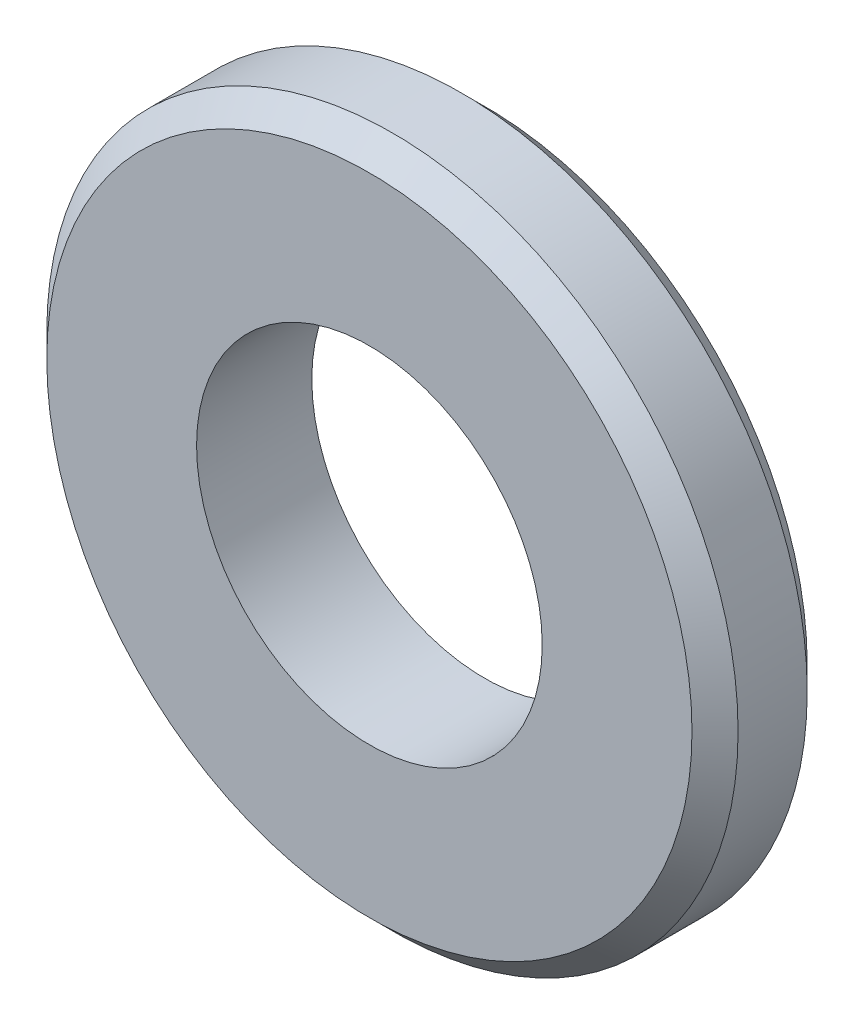
ISO-10303-21;
HEADER;
FILE_DESCRIPTION(('STEP AP214'),'2;1');
FILE_NAME('part.step','',(''),(''),'','','');
FILE_SCHEMA(('AUTOMOTIVE_DESIGN { 1 0 10303 214 1 1 1 1 }'));
ENDSEC;
DATA;
#1=APPLICATION_CONTEXT('core data for automotive mechanical design processes');
#2=APPLICATION_PROTOCOL_DEFINITION('international standard','automotive_design',2000,#1);
#3=PRODUCT_CONTEXT('',#1,'mechanical');
#4=PRODUCT('Part','Part','',(#3));
#5=PRODUCT_RELATED_PRODUCT_CATEGORY('part','',(#4));
#6=PRODUCT_DEFINITION_FORMATION('','',#4);
#7=PRODUCT_DEFINITION_CONTEXT('part definition',#1,'design');
#8=PRODUCT_DEFINITION('design','',#6,#7);
#9=PRODUCT_DEFINITION_SHAPE('','',#8);
#10=(LENGTH_UNIT() NAMED_UNIT(*) SI_UNIT(.MILLI.,.METRE.));
#11=(NAMED_UNIT(*) PLANE_ANGLE_UNIT() SI_UNIT($,.RADIAN.));
#12=(NAMED_UNIT(*) SI_UNIT($,.STERADIAN.) SOLID_ANGLE_UNIT());
#13=UNCERTAINTY_MEASURE_WITH_UNIT(LENGTH_MEASURE(1.E-05),#10,'distance_accuracy_value','');
#14=(GEOMETRIC_REPRESENTATION_CONTEXT(3) GLOBAL_UNCERTAINTY_ASSIGNED_CONTEXT((#13)) GLOBAL_UNIT_ASSIGNED_CONTEXT((#10,
#11,#12)) REPRESENTATION_CONTEXT('',''));
#15=CARTESIAN_POINT('',(0.,0.,0.));
#16=DIRECTION('',(0.,0.,1.));
#17=DIRECTION('',(1.,0.,0.));
#18=AXIS2_PLACEMENT_3D('',#15,#16,#17);
#19=CARTESIAN_POINT('',(0.,0.,0.5));
#20=DIRECTION('',(0.,0.,1.));
#21=DIRECTION('',(1.,0.,0.));
#22=AXIS2_PLACEMENT_3D('',#19,#20,#21);
#23=PLANE('',#22);
#24=CARTESIAN_POINT('',(0.,0.,0.5));
#25=DIRECTION('',(0.,0.,1.));
#26=DIRECTION('',(1.,0.,0.));
#27=AXIS2_PLACEMENT_3D('',#24,#25,#26);
#28=CIRCLE('',#27,2.8);
#29=CARTESIAN_POINT('',(2.8,0.,0.5));
#30=VERTEX_POINT('',#29);
#31=EDGE_CURVE('E51',#30,#30,#28,.T.);
#32=ORIENTED_EDGE('',*,*,#31,.T.);
#33=EDGE_LOOP('',(#32));
#34=FACE_BOUND('',#33,.T.);
#35=CARTESIAN_POINT('',(0.,0.,0.5));
#36=DIRECTION('',(0.,0.,1.));
#37=DIRECTION('',(1.,0.,0.));
#38=AXIS2_PLACEMENT_3D('',#35,#36,#37);
#39=CIRCLE('',#38,1.5);
#40=CARTESIAN_POINT('',(1.5,0.,0.5));
#41=VERTEX_POINT('',#40);
#42=EDGE_CURVE('E56',#41,#41,#39,.T.);
#43=ORIENTED_EDGE('',*,*,#42,.F.);
#44=EDGE_LOOP('',(#43));
#45=FACE_BOUND('',#44,.T.);
#46=ADVANCED_FACE('F35',(#34,#45),#23,.T.);
#47=CARTESIAN_POINT('',(0.,0.,-0.5));
#48=DIRECTION('',(0.,0.,1.));
#49=DIRECTION('',(1.,0.,0.));
#50=AXIS2_PLACEMENT_3D('',#47,#48,#49);
#51=PLANE('',#50);
#52=CARTESIAN_POINT('',(0.,0.,-0.5));
#53=DIRECTION('',(0.,0.,1.));
#54=DIRECTION('',(1.,0.,0.));
#55=AXIS2_PLACEMENT_3D('',#52,#53,#54);
#56=CIRCLE('',#55,2.8);
#57=CARTESIAN_POINT('',(2.8,0.,-0.5));
#58=VERTEX_POINT('',#57);
#59=EDGE_CURVE('E10',#58,#58,#56,.F.);
#60=ORIENTED_EDGE('',*,*,#59,.T.);
#61=EDGE_LOOP('',(#60));
#62=FACE_BOUND('',#61,.T.);
#63=CARTESIAN_POINT('',(0.,0.,-0.5));
#64=DIRECTION('',(0.,0.,1.));
#65=DIRECTION('',(1.,0.,0.));
#66=AXIS2_PLACEMENT_3D('',#63,#64,#65);
#67=CIRCLE('',#66,1.5);
#68=CARTESIAN_POINT('',(1.5,0.,-0.5));
#69=VERTEX_POINT('',#68);
#70=EDGE_CURVE('E57',#69,#69,#67,.T.);
#71=ORIENTED_EDGE('',*,*,#70,.T.);
#72=EDGE_LOOP('',(#71));
#73=FACE_BOUND('',#72,.T.);
#74=ADVANCED_FACE('F67',(#62,#73),#51,.F.);
#75=CARTESIAN_POINT('',(0.,0.,0.5));
#76=DIRECTION('',(0.,0.,-1.));
#77=DIRECTION('',(-1.,0.,0.));
#78=AXIS2_PLACEMENT_3D('',#75,#76,#77);
#79=CYLINDRICAL_SURFACE('',#78,3.);
#80=CARTESIAN_POINT('',(0.,0.,0.299999999999999));
#81=DIRECTION('',(0.,0.,1.));
#82=DIRECTION('',(1.,0.,0.));
#83=AXIS2_PLACEMENT_3D('',#80,#81,#82);
#84=CIRCLE('',#83,3.);
#85=CARTESIAN_POINT('',(3.,0.,0.299999999999999));
#86=VERTEX_POINT('',#85);
#87=EDGE_CURVE('E43',#86,#86,#84,.F.);
#88=ORIENTED_EDGE('',*,*,#87,.T.);
#89=EDGE_LOOP('',(#88));
#90=FACE_BOUND('',#89,.T.);
#91=CARTESIAN_POINT('',(0.,0.,-0.3));
#92=DIRECTION('',(0.,0.,1.));
#93=DIRECTION('',(1.,0.,0.));
#94=AXIS2_PLACEMENT_3D('',#91,#92,#93);
#95=CIRCLE('',#94,3.);
#96=CARTESIAN_POINT('',(3.,0.,-0.3));
#97=VERTEX_POINT('',#96);
#98=EDGE_CURVE('E47',#97,#97,#95,.T.);
#99=ORIENTED_EDGE('',*,*,#98,.T.);
#100=EDGE_LOOP('',(#99));
#101=FACE_BOUND('',#100,.T.);
#102=ADVANCED_FACE('F73',(#90,#101),#79,.T.);
#103=CARTESIAN_POINT('',(0.,0.,0.5));
#104=DIRECTION('',(0.,0.,-1.));
#105=DIRECTION('',(-1.,0.,0.));
#106=AXIS2_PLACEMENT_3D('',#103,#104,#105);
#107=CYLINDRICAL_SURFACE('',#106,1.5);
#108=ORIENTED_EDGE('',*,*,#42,.T.);
#109=EDGE_LOOP('',(#108));
#110=FACE_BOUND('',#109,.T.);
#111=ORIENTED_EDGE('',*,*,#70,.F.);
#112=EDGE_LOOP('',(#111));
#113=FACE_BOUND('',#112,.T.);
#114=ADVANCED_FACE('F63',(#110,#113),#107,.F.);
#115=CARTESIAN_POINT('',(0.,0.,0.5));
#116=DIRECTION('',(0.,0.,-1.));
#117=DIRECTION('',(-1.,0.,0.));
#118=AXIS2_PLACEMENT_3D('',#115,#116,#117);
#119=CONICAL_SURFACE('',#118,2.8,0.785398163397448);
#120=ORIENTED_EDGE('',*,*,#87,.F.);
#121=EDGE_LOOP('',(#120));
#122=FACE_BOUND('',#121,.T.);
#123=ORIENTED_EDGE('',*,*,#31,.F.);
#124=EDGE_LOOP('',(#123));
#125=FACE_BOUND('',#124,.T.);
#126=ADVANCED_FACE('F79',(#122,#125),#119,.T.);
#127=CARTESIAN_POINT('',(0.,0.,-0.3));
#128=DIRECTION('',(0.,0.,1.));
#129=DIRECTION('',(1.,0.,0.));
#130=AXIS2_PLACEMENT_3D('',#127,#128,#129);
#131=CONICAL_SURFACE('',#130,3.,0.78539816339745);
#132=CARTESIAN_POINT('',(2.8,0.,-0.5));
#133=CARTESIAN_POINT('',(2.80208333333333,0.,-0.497916666666667));
#134=CARTESIAN_POINT('',(2.80416666666667,0.,-0.495833333333333));
#135=CARTESIAN_POINT('',(2.80833333333333,0.,-0.491666666666667));
#136=CARTESIAN_POINT('',(2.81041666666667,0.,-0.489583333333333));
#137=CARTESIAN_POINT('',(2.81458333333333,0.,-0.485416666666667));
#138=CARTESIAN_POINT('',(2.81666666666667,0.,-0.483333333333334));
#139=CARTESIAN_POINT('',(2.82083333333333,0.,-0.479166666666667));
#140=CARTESIAN_POINT('',(2.82291666666667,0.,-0.477083333333333));
#141=CARTESIAN_POINT('',(2.82708333333333,0.,-0.472916666666667));
#142=CARTESIAN_POINT('',(2.82916666666667,0.,-0.470833333333333));
#143=CARTESIAN_POINT('',(2.83333333333333,0.,-0.466666666666667));
#144=CARTESIAN_POINT('',(2.83541666666667,0.,-0.464583333333334));
#145=CARTESIAN_POINT('',(2.83958333333333,0.,-0.460416666666667));
#146=CARTESIAN_POINT('',(2.84166666666667,0.,-0.458333333333333));
#147=CARTESIAN_POINT('',(2.84583333333333,0.,-0.454166666666667));
#148=CARTESIAN_POINT('',(2.84791666666667,0.,-0.452083333333333));
#149=CARTESIAN_POINT('',(2.85208333333333,0.,-0.447916666666667));
#150=CARTESIAN_POINT('',(2.85416666666667,0.,-0.445833333333334));
#151=CARTESIAN_POINT('',(2.85833333333333,0.,-0.441666666666667));
#152=CARTESIAN_POINT('',(2.86041666666667,0.,-0.439583333333333));
#153=CARTESIAN_POINT('',(2.86458333333333,0.,-0.435416666666667));
#154=CARTESIAN_POINT('',(2.86666666666667,0.,-0.433333333333334));
#155=CARTESIAN_POINT('',(2.87083333333333,0.,-0.429166666666667));
#156=CARTESIAN_POINT('',(2.87291666666667,0.,-0.427083333333334));
#157=CARTESIAN_POINT('',(2.87708333333333,0.,-0.422916666666667));
#158=CARTESIAN_POINT('',(2.87916666666667,0.,-0.420833333333334));
#159=CARTESIAN_POINT('',(2.88333333333333,0.,-0.416666666666667));
#160=CARTESIAN_POINT('',(2.88541666666667,0.,-0.414583333333334));
#161=CARTESIAN_POINT('',(2.88958333333333,0.,-0.410416666666667));
#162=CARTESIAN_POINT('',(2.89166666666667,0.,-0.408333333333333));
#163=CARTESIAN_POINT('',(2.89583333333333,0.,-0.404166666666667));
#164=CARTESIAN_POINT('',(2.89791666666667,0.,-0.402083333333334));
#165=CARTESIAN_POINT('',(2.90208333333333,0.,-0.397916666666667));
#166=CARTESIAN_POINT('',(2.90416666666667,0.,-0.395833333333334));
#167=CARTESIAN_POINT('',(2.90833333333333,0.,-0.391666666666667));
#168=CARTESIAN_POINT('',(2.91041666666667,0.,-0.389583333333334));
#169=CARTESIAN_POINT('',(2.91458333333333,0.,-0.385416666666667));
#170=CARTESIAN_POINT('',(2.91666666666667,0.,-0.383333333333334));
#171=CARTESIAN_POINT('',(2.92083333333333,0.,-0.379166666666667));
#172=CARTESIAN_POINT('',(2.92291666666667,0.,-0.377083333333334));
#173=CARTESIAN_POINT('',(2.92708333333333,0.,-0.372916666666667));
#174=CARTESIAN_POINT('',(2.92916666666667,0.,-0.370833333333334));
#175=CARTESIAN_POINT('',(2.93333333333333,0.,-0.366666666666667));
#176=CARTESIAN_POINT('',(2.93541666666667,0.,-0.364583333333334));
#177=CARTESIAN_POINT('',(2.93958333333333,0.,-0.360416666666667));
#178=CARTESIAN_POINT('',(2.94166666666667,0.,-0.358333333333334));
#179=CARTESIAN_POINT('',(2.94583333333333,0.,-0.354166666666667));
#180=CARTESIAN_POINT('',(2.94791666666667,0.,-0.352083333333334));
#181=CARTESIAN_POINT('',(2.95208333333333,0.,-0.347916666666667));
#182=CARTESIAN_POINT('',(2.95416666666667,0.,-0.345833333333334));
#183=CARTESIAN_POINT('',(2.95833333333333,0.,-0.341666666666667));
#184=CARTESIAN_POINT('',(2.96041666666667,0.,-0.339583333333334));
#185=CARTESIAN_POINT('',(2.96458333333333,0.,-0.335416666666667));
#186=CARTESIAN_POINT('',(2.96666666666667,0.,-0.333333333333334));
#187=CARTESIAN_POINT('',(2.97083333333333,0.,-0.329166666666667));
#188=CARTESIAN_POINT('',(2.97291666666667,0.,-0.327083333333334));
#189=CARTESIAN_POINT('',(2.97708333333333,0.,-0.322916666666667));
#190=CARTESIAN_POINT('',(2.97916666666667,0.,-0.320833333333334));
#191=CARTESIAN_POINT('',(2.98333333333333,0.,-0.316666666666667));
#192=CARTESIAN_POINT('',(2.98541666666667,0.,-0.314583333333334));
#193=CARTESIAN_POINT('',(2.98958333333333,0.,-0.310416666666667));
#194=CARTESIAN_POINT('',(2.99166666666667,0.,-0.308333333333334));
#195=CARTESIAN_POINT('',(2.99583333333333,0.,-0.304166666666667));
#196=CARTESIAN_POINT('',(2.99791666666667,0.,-0.302083333333334));
#197=CARTESIAN_POINT('',(3.,0.,-0.3));
#198=B_SPLINE_CURVE_WITH_KNOTS('',3,(#132,#133,#134,#135,#136,#137,#138,#139,#140,#141,#142,
#143,#144,#145,#146,#147,#148,#149,#150,#151,#152,#153,#154,#155,#156,#157,#158,#159,#160,#161,
#162,#163,#164,#165,#166,#167,#168,#169,#170,#171,#172,#173,#174,#175,#176,#177,#178,#179,#180,
#181,#182,#183,#184,#185,#186,#187,#188,#189,#190,#191,#192,#193,#194,#195,#196,#197),
.UNSPECIFIED.,.F.,.F.,(4,2,2,2,2,2,2,2,2,2,2,2,2,2,2,2,2,2,2,2,2,2,2,2,2,2,2,2,2,2,2,2,4),(0.,
0.00883883476483171,0.0176776695296637,0.0265165042944956,0.0353553390593272,0.0441941738241593,
0.0530330085889912,0.0618718433538228,0.0707106781186548,0.0795495128834868,0.0883883476483184,
0.0972271824131504,0.106066017177982,0.114904851942814,0.123743686707646,0.132582521472478,
0.14142135623731,0.150260191002141,0.159099025766973,0.167937860531805,0.176776695296637,
0.185615530061469,0.194454364826301,0.203293199591132,0.212132034355964,0.220970869120796,
0.229809703885628,0.23864853865046,0.247487373415292,0.256326208180124,0.265165042944956,
0.274003877709787,0.282842712474619),.UNSPECIFIED.);
#199=EDGE_CURVE('BSEAM38',#58,#97,#198,.T.);
#200=ORIENTED_EDGE('',*,*,#59,.F.);
#201=ORIENTED_EDGE('',*,*,#98,.F.);
#202=ORIENTED_EDGE('',*,*,#199,.T.);
#203=ORIENTED_EDGE('',*,*,#199,.F.);
#204=EDGE_LOOP('',(#200,#202,#201,#203));
#205=FACE_BOUND('',#204,.T.);
#206=ADVANCED_FACE('F38',(#205),#131,.T.);
#207=CLOSED_SHELL('',(#46,#74,#102,#114,#126,#206));
#208=MANIFOLD_SOLID_BREP('B2',#207);
#209=ADVANCED_BREP_SHAPE_REPRESENTATION('',(#18,#208),#14);
#210=SHAPE_DEFINITION_REPRESENTATION(#9,#209);
ENDSEC;
END-ISO-10303-21;
